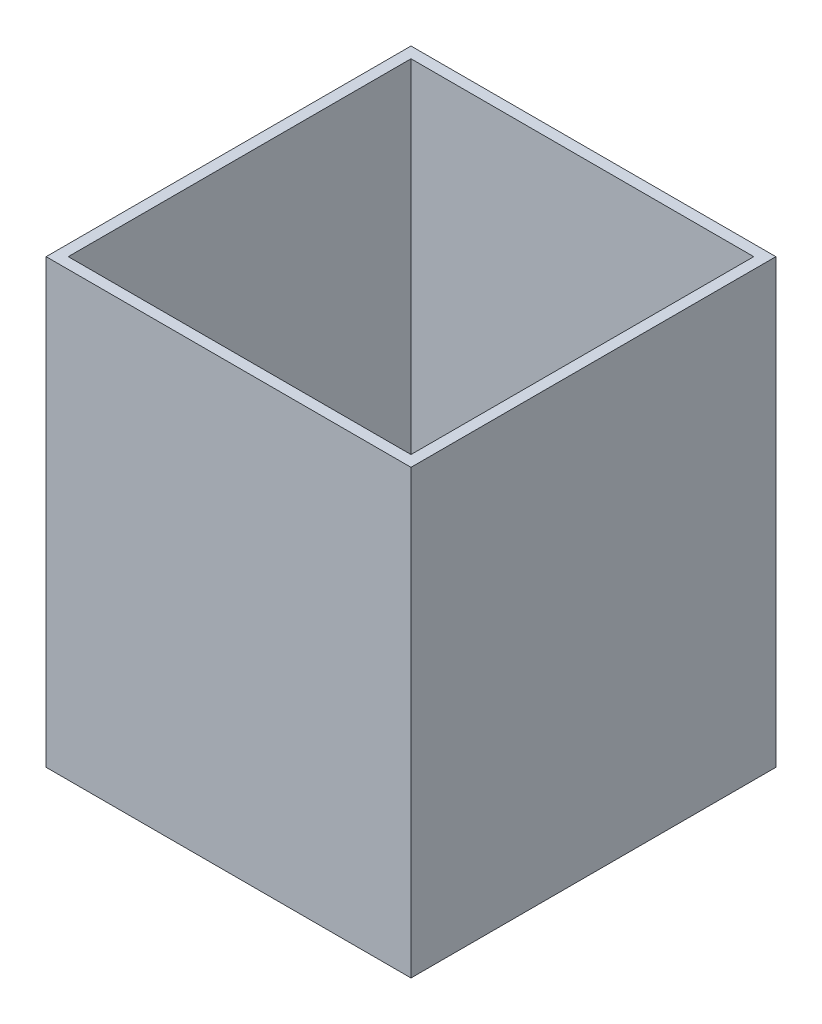
ISO-10303-21;
HEADER;
FILE_DESCRIPTION(('STEP AP214'),'2;1');
FILE_NAME('part.step','',(''),(''),'','','');
FILE_SCHEMA(('AUTOMOTIVE_DESIGN { 1 0 10303 214 1 1 1 1 }'));
ENDSEC;
DATA;
#1=APPLICATION_CONTEXT('core data for automotive mechanical design processes');
#2=APPLICATION_PROTOCOL_DEFINITION('international standard','automotive_design',2000,#1);
#3=PRODUCT_CONTEXT('',#1,'mechanical');
#4=PRODUCT('Part','Part','',(#3));
#5=PRODUCT_RELATED_PRODUCT_CATEGORY('part','',(#4));
#6=PRODUCT_DEFINITION_FORMATION('','',#4);
#7=PRODUCT_DEFINITION_CONTEXT('part definition',#1,'design');
#8=PRODUCT_DEFINITION('design','',#6,#7);
#9=PRODUCT_DEFINITION_SHAPE('','',#8);
#10=(LENGTH_UNIT() NAMED_UNIT(*) SI_UNIT(.MILLI.,.METRE.));
#11=(NAMED_UNIT(*) PLANE_ANGLE_UNIT() SI_UNIT($,.RADIAN.));
#12=(NAMED_UNIT(*) SI_UNIT($,.STERADIAN.) SOLID_ANGLE_UNIT());
#13=UNCERTAINTY_MEASURE_WITH_UNIT(LENGTH_MEASURE(1.E-05),#10,'distance_accuracy_value','');
#14=(GEOMETRIC_REPRESENTATION_CONTEXT(3) GLOBAL_UNCERTAINTY_ASSIGNED_CONTEXT((#13)) GLOBAL_UNIT_ASSIGNED_CONTEXT((#10,
#11,#12)) REPRESENTATION_CONTEXT('',''));
#15=CARTESIAN_POINT('',(0.,0.,0.));
#16=DIRECTION('',(0.,0.,1.));
#17=DIRECTION('',(1.,0.,0.));
#18=AXIS2_PLACEMENT_3D('',#15,#16,#17);
#19=CARTESIAN_POINT('',(0.,40.,0.));
#20=DIRECTION('',(0.,-1.,0.));
#21=DIRECTION('',(0.,0.,-1.));
#22=AXIS2_PLACEMENT_3D('',#19,#20,#21);
#23=PLANE('',#22);
#24=DIRECTION('',(0.,0.,1.));
#25=VECTOR('',#24,1.);
#26=CARTESIAN_POINT('',(0.,40.,0.));
#27=LINE('',#26,#25);
#28=CARTESIAN_POINT('',(0.,40.,-33.));
#29=VERTEX_POINT('',#28);
#30=CARTESIAN_POINT('',(0.,40.,0.));
#31=VERTEX_POINT('',#30);
#32=EDGE_CURVE('E135',#29,#31,#27,.T.);
#33=ORIENTED_EDGE('',*,*,#32,.T.);
#34=DIRECTION('',(1.,0.,0.));
#35=VECTOR('',#34,1.);
#36=CARTESIAN_POINT('',(0.,40.,0.));
#37=LINE('',#36,#35);
#38=CARTESIAN_POINT('',(33.,40.,0.));
#39=VERTEX_POINT('',#38);
#40=EDGE_CURVE('E138',#31,#39,#37,.T.);
#41=ORIENTED_EDGE('',*,*,#40,.T.);
#42=DIRECTION('',(0.,0.,-1.));
#43=VECTOR('',#42,1.);
#44=CARTESIAN_POINT('',(33.,40.,0.));
#45=LINE('',#44,#43);
#46=CARTESIAN_POINT('',(33.,40.,-33.));
#47=VERTEX_POINT('',#46);
#48=EDGE_CURVE('E141',#39,#47,#45,.T.);
#49=ORIENTED_EDGE('',*,*,#48,.T.);
#50=DIRECTION('',(-1.,0.,0.));
#51=VECTOR('',#50,1.);
#52=CARTESIAN_POINT('',(0.,40.,-33.));
#53=LINE('',#52,#51);
#54=EDGE_CURVE('E143',#47,#29,#53,.T.);
#55=ORIENTED_EDGE('',*,*,#54,.T.);
#56=EDGE_LOOP('',(#33,#41,#49,#55));
#57=FACE_BOUND('',#56,.T.);
#58=DIRECTION('',(1.,0.,0.));
#59=VECTOR('',#58,1.);
#60=CARTESIAN_POINT('',(1.,40.,-1.));
#61=LINE('',#60,#59);
#62=CARTESIAN_POINT('',(1.,40.,-1.));
#63=VERTEX_POINT('',#62);
#64=CARTESIAN_POINT('',(32.,40.,-1.));
#65=VERTEX_POINT('',#64);
#66=EDGE_CURVE('E119',#63,#65,#61,.T.);
#67=ORIENTED_EDGE('',*,*,#66,.F.);
#68=DIRECTION('',(0.,0.,1.));
#69=VECTOR('',#68,1.);
#70=CARTESIAN_POINT('',(1.,40.,-1.));
#71=LINE('',#70,#69);
#72=CARTESIAN_POINT('',(1.,40.,-32.));
#73=VERTEX_POINT('',#72);
#74=EDGE_CURVE('E106',#73,#63,#71,.T.);
#75=ORIENTED_EDGE('',*,*,#74,.F.);
#76=DIRECTION('',(-1.,0.,0.));
#77=VECTOR('',#76,1.);
#78=CARTESIAN_POINT('',(1.,40.,-32.));
#79=LINE('',#78,#77);
#80=CARTESIAN_POINT('',(32.,40.,-32.));
#81=VERTEX_POINT('',#80);
#82=EDGE_CURVE('E126',#81,#73,#79,.T.);
#83=ORIENTED_EDGE('',*,*,#82,.F.);
#84=DIRECTION('',(0.,0.,-1.));
#85=VECTOR('',#84,1.);
#86=CARTESIAN_POINT('',(32.,40.,-1.));
#87=LINE('',#86,#85);
#88=EDGE_CURVE('E124',#65,#81,#87,.T.);
#89=ORIENTED_EDGE('',*,*,#88,.F.);
#90=EDGE_LOOP('',(#67,#75,#83,#89));
#91=FACE_BOUND('',#90,.T.);
#92=ADVANCED_FACE('F33',(#57,#91),#23,.F.);
#93=CARTESIAN_POINT('',(0.,0.,0.));
#94=DIRECTION('',(0.,-1.,0.));
#95=DIRECTION('',(0.,0.,-1.));
#96=AXIS2_PLACEMENT_3D('',#93,#94,#95);
#97=PLANE('',#96);
#98=DIRECTION('',(0.,0.,1.));
#99=VECTOR('',#98,1.);
#100=CARTESIAN_POINT('',(0.,0.,0.));
#101=LINE('',#100,#99);
#102=CARTESIAN_POINT('',(0.,0.,-33.));
#103=VERTEX_POINT('',#102);
#104=CARTESIAN_POINT('',(0.,0.,0.));
#105=VERTEX_POINT('',#104);
#106=EDGE_CURVE('E134',#103,#105,#101,.T.);
#107=ORIENTED_EDGE('',*,*,#106,.F.);
#108=DIRECTION('',(-1.,0.,0.));
#109=VECTOR('',#108,1.);
#110=CARTESIAN_POINT('',(0.,0.,-33.));
#111=LINE('',#110,#109);
#112=CARTESIAN_POINT('',(33.,0.,-33.));
#113=VERTEX_POINT('',#112);
#114=EDGE_CURVE('E139',#113,#103,#111,.T.);
#115=ORIENTED_EDGE('',*,*,#114,.F.);
#116=DIRECTION('',(0.,0.,-1.));
#117=VECTOR('',#116,1.);
#118=CARTESIAN_POINT('',(33.,0.,0.));
#119=LINE('',#118,#117);
#120=CARTESIAN_POINT('',(33.,0.,0.));
#121=VERTEX_POINT('',#120);
#122=EDGE_CURVE('E150',#121,#113,#119,.T.);
#123=ORIENTED_EDGE('',*,*,#122,.F.);
#124=DIRECTION('',(1.,0.,0.));
#125=VECTOR('',#124,1.);
#126=CARTESIAN_POINT('',(0.,0.,0.));
#127=LINE('',#126,#125);
#128=EDGE_CURVE('E148',#105,#121,#127,.T.);
#129=ORIENTED_EDGE('',*,*,#128,.F.);
#130=EDGE_LOOP('',(#107,#115,#123,#129));
#131=FACE_BOUND('',#130,.T.);
#132=ADVANCED_FACE('F168',(#131),#97,.T.);
#133=CARTESIAN_POINT('',(0.,40.,0.));
#134=DIRECTION('',(1.,0.,0.));
#135=DIRECTION('',(0.,0.,-1.));
#136=AXIS2_PLACEMENT_3D('',#133,#134,#135);
#137=PLANE('',#136);
#138=ORIENTED_EDGE('',*,*,#106,.T.);
#139=DIRECTION('',(0.,-1.,0.));
#140=VECTOR('',#139,1.);
#141=CARTESIAN_POINT('',(0.,40.,0.));
#142=LINE('',#141,#140);
#143=EDGE_CURVE('E11',#31,#105,#142,.T.);
#144=ORIENTED_EDGE('',*,*,#143,.F.);
#145=ORIENTED_EDGE('',*,*,#32,.F.);
#146=DIRECTION('',(0.,-1.,0.));
#147=VECTOR('',#146,1.);
#148=CARTESIAN_POINT('',(0.,40.,-33.));
#149=LINE('',#148,#147);
#150=EDGE_CURVE('E145',#29,#103,#149,.T.);
#151=ORIENTED_EDGE('',*,*,#150,.T.);
#152=EDGE_LOOP('',(#138,#144,#145,#151));
#153=FACE_BOUND('',#152,.T.);
#154=ADVANCED_FACE('F35',(#153),#137,.F.);
#155=CARTESIAN_POINT('',(0.,40.,0.));
#156=DIRECTION('',(0.,0.,-1.));
#157=DIRECTION('',(-1.,0.,0.));
#158=AXIS2_PLACEMENT_3D('',#155,#156,#157);
#159=PLANE('',#158);
#160=ORIENTED_EDGE('',*,*,#128,.T.);
#161=DIRECTION('',(0.,-1.,0.));
#162=VECTOR('',#161,1.);
#163=CARTESIAN_POINT('',(33.,40.,0.));
#164=LINE('',#163,#162);
#165=EDGE_CURVE('E41',#39,#121,#164,.T.);
#166=ORIENTED_EDGE('',*,*,#165,.F.);
#167=ORIENTED_EDGE('',*,*,#40,.F.);
#168=ORIENTED_EDGE('',*,*,#143,.T.);
#169=EDGE_LOOP('',(#160,#166,#167,#168));
#170=FACE_BOUND('',#169,.T.);
#171=ADVANCED_FACE('F178',(#170),#159,.F.);
#172=CARTESIAN_POINT('',(33.,40.,0.));
#173=DIRECTION('',(-1.,0.,0.));
#174=DIRECTION('',(0.,0.,1.));
#175=AXIS2_PLACEMENT_3D('',#172,#173,#174);
#176=PLANE('',#175);
#177=ORIENTED_EDGE('',*,*,#122,.T.);
#178=DIRECTION('',(0.,-1.,0.));
#179=VECTOR('',#178,1.);
#180=CARTESIAN_POINT('',(33.,40.,-33.));
#181=LINE('',#180,#179);
#182=EDGE_CURVE('E155',#47,#113,#181,.T.);
#183=ORIENTED_EDGE('',*,*,#182,.F.);
#184=ORIENTED_EDGE('',*,*,#48,.F.);
#185=ORIENTED_EDGE('',*,*,#165,.T.);
#186=EDGE_LOOP('',(#177,#183,#184,#185));
#187=FACE_BOUND('',#186,.T.);
#188=ADVANCED_FACE('F162',(#187),#176,.F.);
#189=CARTESIAN_POINT('',(0.,40.,-33.));
#190=DIRECTION('',(0.,0.,1.));
#191=DIRECTION('',(1.,0.,0.));
#192=AXIS2_PLACEMENT_3D('',#189,#190,#191);
#193=PLANE('',#192);
#194=ORIENTED_EDGE('',*,*,#114,.T.);
#195=ORIENTED_EDGE('',*,*,#150,.F.);
#196=ORIENTED_EDGE('',*,*,#54,.F.);
#197=ORIENTED_EDGE('',*,*,#182,.T.);
#198=EDGE_LOOP('',(#194,#195,#196,#197));
#199=FACE_BOUND('',#198,.T.);
#200=ADVANCED_FACE('F171',(#199),#193,.F.);
#201=CARTESIAN_POINT('',(1.,40.,-1.));
#202=DIRECTION('',(0.,0.,-1.));
#203=DIRECTION('',(-1.,0.,0.));
#204=AXIS2_PLACEMENT_3D('',#201,#202,#203);
#205=PLANE('',#204);
#206=DIRECTION('',(-1.,0.,0.));
#207=VECTOR('',#206,1.);
#208=CARTESIAN_POINT('',(32.,1.,-1.));
#209=LINE('',#208,#207);
#210=CARTESIAN_POINT('',(32.,1.,-1.));
#211=VERTEX_POINT('',#210);
#212=CARTESIAN_POINT('',(0.999999999999996,1.,-1.));
#213=VERTEX_POINT('',#212);
#214=EDGE_CURVE('E112',#211,#213,#209,.T.);
#215=ORIENTED_EDGE('',*,*,#214,.T.);
#216=DIRECTION('',(0.,-1.,0.));
#217=VECTOR('',#216,1.);
#218=CARTESIAN_POINT('',(1.,40.,-1.));
#219=LINE('',#218,#217);
#220=EDGE_CURVE('E100',#63,#213,#219,.T.);
#221=ORIENTED_EDGE('',*,*,#220,.F.);
#222=ORIENTED_EDGE('',*,*,#66,.T.);
#223=DIRECTION('',(0.,-1.,0.));
#224=VECTOR('',#223,1.);
#225=CARTESIAN_POINT('',(32.,40.,-1.));
#226=LINE('',#225,#224);
#227=EDGE_CURVE('E114',#65,#211,#226,.T.);
#228=ORIENTED_EDGE('',*,*,#227,.T.);
#229=EDGE_LOOP('',(#215,#221,#222,#228));
#230=FACE_BOUND('',#229,.T.);
#231=ADVANCED_FACE('F113',(#230),#205,.T.);
#232=CARTESIAN_POINT('',(32.,40.,-1.));
#233=DIRECTION('',(-1.,0.,0.));
#234=DIRECTION('',(0.,0.,1.));
#235=AXIS2_PLACEMENT_3D('',#232,#233,#234);
#236=PLANE('',#235);
#237=DIRECTION('',(0.,0.,1.));
#238=VECTOR('',#237,1.);
#239=CARTESIAN_POINT('',(32.,1.,-1.));
#240=LINE('',#239,#238);
#241=CARTESIAN_POINT('',(32.,1.,-32.));
#242=VERTEX_POINT('',#241);
#243=EDGE_CURVE('E48',#242,#211,#240,.T.);
#244=ORIENTED_EDGE('',*,*,#243,.T.);
#245=ORIENTED_EDGE('',*,*,#227,.F.);
#246=ORIENTED_EDGE('',*,*,#88,.T.);
#247=DIRECTION('',(0.,-1.,0.));
#248=VECTOR('',#247,1.);
#249=CARTESIAN_POINT('',(32.,40.,-32.));
#250=LINE('',#249,#248);
#251=EDGE_CURVE('E131',#81,#242,#250,.T.);
#252=ORIENTED_EDGE('',*,*,#251,.T.);
#253=EDGE_LOOP('',(#244,#245,#246,#252));
#254=FACE_BOUND('',#253,.T.);
#255=ADVANCED_FACE('F198',(#254),#236,.T.);
#256=CARTESIAN_POINT('',(1.,40.,-32.));
#257=DIRECTION('',(0.,0.,1.));
#258=DIRECTION('',(1.,0.,0.));
#259=AXIS2_PLACEMENT_3D('',#256,#257,#258);
#260=PLANE('',#259);
#261=DIRECTION('',(1.,0.,0.));
#262=VECTOR('',#261,1.);
#263=CARTESIAN_POINT('',(32.,1.,-32.));
#264=LINE('',#263,#262);
#265=CARTESIAN_POINT('',(1.,1.,-32.));
#266=VERTEX_POINT('',#265);
#267=EDGE_CURVE('E56',#266,#242,#264,.T.);
#268=ORIENTED_EDGE('',*,*,#267,.T.);
#269=ORIENTED_EDGE('',*,*,#251,.F.);
#270=ORIENTED_EDGE('',*,*,#82,.T.);
#271=DIRECTION('',(0.,-1.,0.));
#272=VECTOR('',#271,1.);
#273=CARTESIAN_POINT('',(1.,40.,-32.));
#274=LINE('',#273,#272);
#275=EDGE_CURVE('E109',#73,#266,#274,.T.);
#276=ORIENTED_EDGE('',*,*,#275,.T.);
#277=EDGE_LOOP('',(#268,#269,#270,#276));
#278=FACE_BOUND('',#277,.T.);
#279=ADVANCED_FACE('F202',(#278),#260,.T.);
#280=CARTESIAN_POINT('',(1.,40.,-1.));
#281=DIRECTION('',(1.,0.,0.));
#282=DIRECTION('',(0.,0.,-1.));
#283=AXIS2_PLACEMENT_3D('',#280,#281,#282);
#284=PLANE('',#283);
#285=DIRECTION('',(0.,0.,-1.));
#286=VECTOR('',#285,1.);
#287=CARTESIAN_POINT('',(0.999999999999996,1.,-1.));
#288=LINE('',#287,#286);
#289=EDGE_CURVE('E104',#213,#266,#288,.T.);
#290=ORIENTED_EDGE('',*,*,#289,.T.);
#291=ORIENTED_EDGE('',*,*,#275,.F.);
#292=ORIENTED_EDGE('',*,*,#74,.T.);
#293=ORIENTED_EDGE('',*,*,#220,.T.);
#294=EDGE_LOOP('',(#290,#291,#292,#293));
#295=FACE_BOUND('',#294,.T.);
#296=ADVANCED_FACE('F102',(#295),#284,.T.);
#297=CARTESIAN_POINT('',(0.,1.,0.));
#298=DIRECTION('',(0.,1.,0.));
#299=DIRECTION('',(0.,0.,1.));
#300=AXIS2_PLACEMENT_3D('',#297,#298,#299);
#301=PLANE('',#300);
#302=ORIENTED_EDGE('',*,*,#243,.F.);
#303=ORIENTED_EDGE('',*,*,#267,.F.);
#304=ORIENTED_EDGE('',*,*,#289,.F.);
#305=ORIENTED_EDGE('',*,*,#214,.F.);
#306=EDGE_LOOP('',(#302,#303,#304,#305));
#307=FACE_BOUND('',#306,.T.);
#308=ADVANCED_FACE('F117',(#307),#301,.T.);
#309=CLOSED_SHELL('',(#92,#132,#154,#171,#188,#200,#231,#255,#279,#296,#308));
#310=MANIFOLD_SOLID_BREP('B2',#309);
#311=ADVANCED_BREP_SHAPE_REPRESENTATION('',(#18,#310),#14);
#312=SHAPE_DEFINITION_REPRESENTATION(#9,#311);
ENDSEC;
END-ISO-10303-21;
